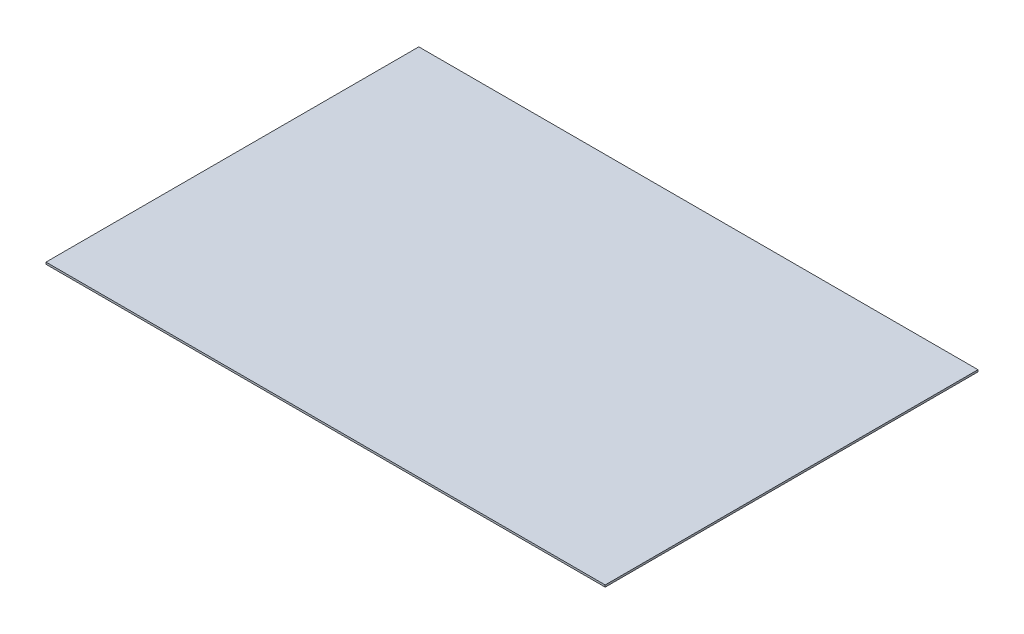
ISO-10303-21;
HEADER;
FILE_DESCRIPTION(('STEP AP214'),'2;1');
FILE_NAME('part.step','',(''),(''),'','','');
FILE_SCHEMA(('AUTOMOTIVE_DESIGN { 1 0 10303 214 1 1 1 1 }'));
ENDSEC;
DATA;
#1=APPLICATION_CONTEXT('core data for automotive mechanical design processes');
#2=APPLICATION_PROTOCOL_DEFINITION('international standard','automotive_design',2000,#1);
#3=PRODUCT_CONTEXT('',#1,'mechanical');
#4=PRODUCT('Part','Part','',(#3));
#5=PRODUCT_RELATED_PRODUCT_CATEGORY('part','',(#4));
#6=PRODUCT_DEFINITION_FORMATION('','',#4);
#7=PRODUCT_DEFINITION_CONTEXT('part definition',#1,'design');
#8=PRODUCT_DEFINITION('design','',#6,#7);
#9=PRODUCT_DEFINITION_SHAPE('','',#8);
#10=(LENGTH_UNIT() NAMED_UNIT(*) SI_UNIT(.MILLI.,.METRE.));
#11=(NAMED_UNIT(*) PLANE_ANGLE_UNIT() SI_UNIT($,.RADIAN.));
#12=(NAMED_UNIT(*) SI_UNIT($,.STERADIAN.) SOLID_ANGLE_UNIT());
#13=UNCERTAINTY_MEASURE_WITH_UNIT(LENGTH_MEASURE(1.E-05),#10,'distance_accuracy_value','');
#14=(GEOMETRIC_REPRESENTATION_CONTEXT(3) GLOBAL_UNCERTAINTY_ASSIGNED_CONTEXT((#13)) GLOBAL_UNIT_ASSIGNED_CONTEXT((#10,
#11,#12)) REPRESENTATION_CONTEXT('',''));
#15=CARTESIAN_POINT('',(0.,0.,0.));
#16=DIRECTION('',(0.,0.,1.));
#17=DIRECTION('',(1.,0.,0.));
#18=AXIS2_PLACEMENT_3D('',#15,#16,#17);
#19=CARTESIAN_POINT('',(914.400000000001,6.35,609.6));
#20=DIRECTION('',(-1.,0.,0.));
#21=DIRECTION('',(0.,0.,1.));
#22=AXIS2_PLACEMENT_3D('',#19,#20,#21);
#23=PLANE('',#22);
#24=DIRECTION('',(0.,0.,-1.));
#25=VECTOR('',#24,1.);
#26=CARTESIAN_POINT('',(914.400000000001,0.,609.6));
#27=LINE('',#26,#25);
#28=CARTESIAN_POINT('',(914.400000000001,0.,609.6));
#29=VERTEX_POINT('',#28);
#30=CARTESIAN_POINT('',(914.400000000001,0.,-609.6));
#31=VERTEX_POINT('',#30);
#32=EDGE_CURVE('E111',#29,#31,#27,.T.);
#33=ORIENTED_EDGE('',*,*,#32,.T.);
#34=DIRECTION('',(0.,-1.,0.));
#35=VECTOR('',#34,1.);
#36=CARTESIAN_POINT('',(914.400000000001,6.35,-609.6));
#37=LINE('',#36,#35);
#38=CARTESIAN_POINT('',(914.400000000001,6.35,-609.6));
#39=VERTEX_POINT('',#38);
#40=EDGE_CURVE('E11',#39,#31,#37,.T.);
#41=ORIENTED_EDGE('',*,*,#40,.F.);
#42=DIRECTION('',(0.,0.,-1.));
#43=VECTOR('',#42,1.);
#44=CARTESIAN_POINT('',(914.400000000001,6.35,609.6));
#45=LINE('',#44,#43);
#46=CARTESIAN_POINT('',(914.400000000001,6.35,609.6));
#47=VERTEX_POINT('',#46);
#48=EDGE_CURVE('E95',#47,#39,#45,.T.);
#49=ORIENTED_EDGE('',*,*,#48,.F.);
#50=DIRECTION('',(0.,-1.,0.));
#51=VECTOR('',#50,1.);
#52=CARTESIAN_POINT('',(914.400000000001,6.35,609.6));
#53=LINE('',#52,#51);
#54=EDGE_CURVE('E107',#47,#29,#53,.T.);
#55=ORIENTED_EDGE('',*,*,#54,.T.);
#56=EDGE_LOOP('',(#33,#41,#49,#55));
#57=FACE_BOUND('',#56,.T.);
#58=ADVANCED_FACE('F43',(#57),#23,.F.);
#59=CARTESIAN_POINT('',(-914.4,6.35,-609.6));
#60=DIRECTION('',(0.,0.,1.));
#61=DIRECTION('',(1.,0.,0.));
#62=AXIS2_PLACEMENT_3D('',#59,#60,#61);
#63=PLANE('',#62);
#64=DIRECTION('',(-1.,0.,0.));
#65=VECTOR('',#64,1.);
#66=CARTESIAN_POINT('',(-914.4,0.,-609.6));
#67=LINE('',#66,#65);
#68=CARTESIAN_POINT('',(-914.4,0.,-609.6));
#69=VERTEX_POINT('',#68);
#70=EDGE_CURVE('E100',#31,#69,#67,.T.);
#71=ORIENTED_EDGE('',*,*,#70,.T.);
#72=DIRECTION('',(0.,-1.,0.));
#73=VECTOR('',#72,1.);
#74=CARTESIAN_POINT('',(-914.4,6.35,-609.6));
#75=LINE('',#74,#73);
#76=CARTESIAN_POINT('',(-914.4,6.35,-609.6));
#77=VERTEX_POINT('',#76);
#78=EDGE_CURVE('E52',#77,#69,#75,.T.);
#79=ORIENTED_EDGE('',*,*,#78,.F.);
#80=DIRECTION('',(-1.,0.,0.));
#81=VECTOR('',#80,1.);
#82=CARTESIAN_POINT('',(-914.4,6.35,-609.6));
#83=LINE('',#82,#81);
#84=EDGE_CURVE('E90',#39,#77,#83,.T.);
#85=ORIENTED_EDGE('',*,*,#84,.F.);
#86=ORIENTED_EDGE('',*,*,#40,.T.);
#87=EDGE_LOOP('',(#71,#79,#85,#86));
#88=FACE_BOUND('',#87,.T.);
#89=ADVANCED_FACE('F99',(#88),#63,.F.);
#90=CARTESIAN_POINT('',(-914.4,6.35,609.6));
#91=DIRECTION('',(1.,0.,0.));
#92=DIRECTION('',(0.,0.,-1.));
#93=AXIS2_PLACEMENT_3D('',#90,#91,#92);
#94=PLANE('',#93);
#95=DIRECTION('',(0.,0.,1.));
#96=VECTOR('',#95,1.);
#97=CARTESIAN_POINT('',(-914.4,0.,609.6));
#98=LINE('',#97,#96);
#99=CARTESIAN_POINT('',(-914.4,0.,609.6));
#100=VERTEX_POINT('',#99);
#101=EDGE_CURVE('E77',#69,#100,#98,.T.);
#102=ORIENTED_EDGE('',*,*,#101,.T.);
#103=DIRECTION('',(0.,-1.,0.));
#104=VECTOR('',#103,1.);
#105=CARTESIAN_POINT('',(-914.4,6.35,609.6));
#106=LINE('',#105,#104);
#107=CARTESIAN_POINT('',(-914.4,6.35,609.6));
#108=VERTEX_POINT('',#107);
#109=EDGE_CURVE('E102',#108,#100,#106,.T.);
#110=ORIENTED_EDGE('',*,*,#109,.F.);
#111=DIRECTION('',(0.,0.,1.));
#112=VECTOR('',#111,1.);
#113=CARTESIAN_POINT('',(-914.4,6.35,609.6));
#114=LINE('',#113,#112);
#115=EDGE_CURVE('E93',#77,#108,#114,.T.);
#116=ORIENTED_EDGE('',*,*,#115,.F.);
#117=ORIENTED_EDGE('',*,*,#78,.T.);
#118=EDGE_LOOP('',(#102,#110,#116,#117));
#119=FACE_BOUND('',#118,.T.);
#120=ADVANCED_FACE('F103',(#119),#94,.F.);
#121=CARTESIAN_POINT('',(-914.4,6.35,609.6));
#122=DIRECTION('',(0.,0.,-1.));
#123=DIRECTION('',(-1.,0.,0.));
#124=AXIS2_PLACEMENT_3D('',#121,#122,#123);
#125=PLANE('',#124);
#126=DIRECTION('',(1.,0.,0.));
#127=VECTOR('',#126,1.);
#128=CARTESIAN_POINT('',(-914.4,0.,609.6));
#129=LINE('',#128,#127);
#130=EDGE_CURVE('E83',#100,#29,#129,.T.);
#131=ORIENTED_EDGE('',*,*,#130,.T.);
#132=ORIENTED_EDGE('',*,*,#54,.F.);
#133=DIRECTION('',(1.,0.,0.));
#134=VECTOR('',#133,1.);
#135=CARTESIAN_POINT('',(-914.4,6.35,609.6));
#136=LINE('',#135,#134);
#137=EDGE_CURVE('E60',#108,#47,#136,.T.);
#138=ORIENTED_EDGE('',*,*,#137,.F.);
#139=ORIENTED_EDGE('',*,*,#109,.T.);
#140=EDGE_LOOP('',(#131,#132,#138,#139));
#141=FACE_BOUND('',#140,.T.);
#142=ADVANCED_FACE('F124',(#141),#125,.F.);
#143=CARTESIAN_POINT('',(0.,6.35,0.));
#144=DIRECTION('',(0.,-1.,0.));
#145=DIRECTION('',(0.,0.,-1.));
#146=AXIS2_PLACEMENT_3D('',#143,#144,#145);
#147=PLANE('',#146);
#148=ORIENTED_EDGE('',*,*,#48,.T.);
#149=ORIENTED_EDGE('',*,*,#84,.T.);
#150=ORIENTED_EDGE('',*,*,#115,.T.);
#151=ORIENTED_EDGE('',*,*,#137,.T.);
#152=EDGE_LOOP('',(#148,#149,#150,#151));
#153=FACE_BOUND('',#152,.T.);
#154=ADVANCED_FACE('F91',(#153),#147,.F.);
#155=CARTESIAN_POINT('',(0.,0.,0.));
#156=DIRECTION('',(0.,-1.,0.));
#157=DIRECTION('',(0.,0.,-1.));
#158=AXIS2_PLACEMENT_3D('',#155,#156,#157);
#159=PLANE('',#158);
#160=ORIENTED_EDGE('',*,*,#32,.F.);
#161=ORIENTED_EDGE('',*,*,#130,.F.);
#162=ORIENTED_EDGE('',*,*,#101,.F.);
#163=ORIENTED_EDGE('',*,*,#70,.F.);
#164=EDGE_LOOP('',(#160,#161,#162,#163));
#165=FACE_BOUND('',#164,.T.);
#166=ADVANCED_FACE('F127',(#165),#159,.T.);
#167=CLOSED_SHELL('',(#58,#89,#120,#142,#154,#166));
#168=MANIFOLD_SOLID_BREP('B2',#167);
#169=ADVANCED_BREP_SHAPE_REPRESENTATION('',(#18,#168),#14);
#170=SHAPE_DEFINITION_REPRESENTATION(#9,#169);
ENDSEC;
END-ISO-10303-21;
